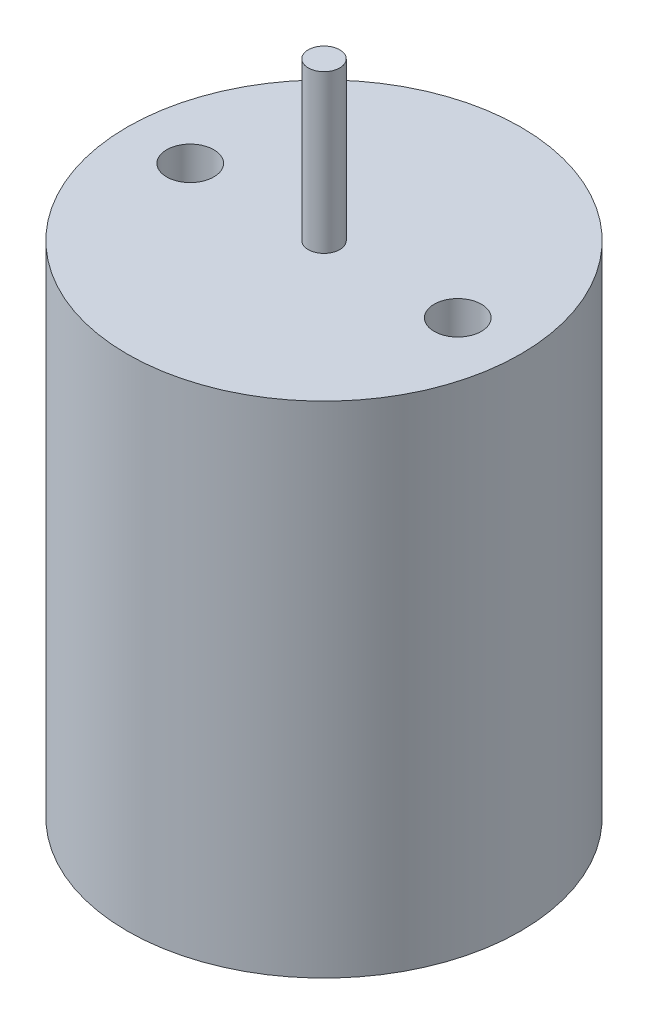
ISO-10303-21;
HEADER;
FILE_DESCRIPTION(('STEP AP214'),'2;1');
FILE_NAME('part.step','',(''),(''),'','','');
FILE_SCHEMA(('AUTOMOTIVE_DESIGN { 1 0 10303 214 1 1 1 1 }'));
ENDSEC;
DATA;
#1=APPLICATION_CONTEXT('core data for automotive mechanical design processes');
#2=APPLICATION_PROTOCOL_DEFINITION('international standard','automotive_design',2000,#1);
#3=PRODUCT_CONTEXT('',#1,'mechanical');
#4=PRODUCT('Part','Part','',(#3));
#5=PRODUCT_RELATED_PRODUCT_CATEGORY('part','',(#4));
#6=PRODUCT_DEFINITION_FORMATION('','',#4);
#7=PRODUCT_DEFINITION_CONTEXT('part definition',#1,'design');
#8=PRODUCT_DEFINITION('design','',#6,#7);
#9=PRODUCT_DEFINITION_SHAPE('','',#8);
#10=(LENGTH_UNIT() NAMED_UNIT(*) SI_UNIT(.MILLI.,.METRE.));
#11=(NAMED_UNIT(*) PLANE_ANGLE_UNIT() SI_UNIT($,.RADIAN.));
#12=(NAMED_UNIT(*) SI_UNIT($,.STERADIAN.) SOLID_ANGLE_UNIT());
#13=UNCERTAINTY_MEASURE_WITH_UNIT(LENGTH_MEASURE(1.E-05),#10,'distance_accuracy_value','');
#14=(GEOMETRIC_REPRESENTATION_CONTEXT(3) GLOBAL_UNCERTAINTY_ASSIGNED_CONTEXT((#13)) GLOBAL_UNIT_ASSIGNED_CONTEXT((#10,
#11,#12)) REPRESENTATION_CONTEXT('',''));
#15=CARTESIAN_POINT('',(0.,0.,0.));
#16=DIRECTION('',(0.,0.,1.));
#17=DIRECTION('',(1.,0.,0.));
#18=AXIS2_PLACEMENT_3D('',#15,#16,#17);
#19=CARTESIAN_POINT('',(0.,31.75,0.));
#20=DIRECTION('',(0.,-1.,0.));
#21=DIRECTION('',(0.,0.,-1.));
#22=AXIS2_PLACEMENT_3D('',#19,#20,#21);
#23=CYLINDRICAL_SURFACE('',#22,12.5);
#24=CARTESIAN_POINT('',(0.,31.75,0.));
#25=DIRECTION('',(0.,1.,0.));
#26=DIRECTION('',(0.,0.,1.));
#27=AXIS2_PLACEMENT_3D('',#24,#25,#26);
#28=CIRCLE('',#27,12.5);
#29=CARTESIAN_POINT('',(0.,31.75,12.5));
#30=VERTEX_POINT('',#29);
#31=EDGE_CURVE('E10',#30,#30,#28,.T.);
#32=ORIENTED_EDGE('',*,*,#31,.F.);
#33=EDGE_LOOP('',(#32));
#34=FACE_BOUND('',#33,.T.);
#35=CARTESIAN_POINT('',(0.,0.,0.));
#36=DIRECTION('',(0.,1.,0.));
#37=DIRECTION('',(0.,0.,1.));
#38=AXIS2_PLACEMENT_3D('',#35,#36,#37);
#39=CIRCLE('',#38,12.5);
#40=CARTESIAN_POINT('',(0.,0.,12.5));
#41=VERTEX_POINT('',#40);
#42=EDGE_CURVE('E42',#41,#41,#39,.T.);
#43=ORIENTED_EDGE('',*,*,#42,.T.);
#44=EDGE_LOOP('',(#43));
#45=FACE_BOUND('',#44,.T.);
#46=ADVANCED_FACE('F39',(#34,#45),#23,.T.);
#47=CARTESIAN_POINT('',(0.,31.75,0.));
#48=DIRECTION('',(0.,1.,0.));
#49=DIRECTION('',(0.,0.,1.));
#50=AXIS2_PLACEMENT_3D('',#47,#48,#49);
#51=PLANE('',#50);
#52=CARTESIAN_POINT('',(-8.5,31.75,0.));
#53=DIRECTION('',(0.,1.,0.));
#54=DIRECTION('',(0.,0.,1.));
#55=AXIS2_PLACEMENT_3D('',#52,#53,#54);
#56=CIRCLE('',#55,1.5);
#57=CARTESIAN_POINT('',(-8.5,31.75,1.5));
#58=VERTEX_POINT('',#57);
#59=EDGE_CURVE('E69',#58,#58,#56,.T.);
#60=ORIENTED_EDGE('',*,*,#59,.F.);
#61=EDGE_LOOP('',(#60));
#62=FACE_BOUND('',#61,.T.);
#63=CARTESIAN_POINT('',(8.5,31.75,0.));
#64=DIRECTION('',(0.,1.,0.));
#65=DIRECTION('',(0.,0.,1.));
#66=AXIS2_PLACEMENT_3D('',#63,#64,#65);
#67=CIRCLE('',#66,1.5);
#68=CARTESIAN_POINT('',(8.5,31.75,1.5));
#69=VERTEX_POINT('',#68);
#70=EDGE_CURVE('E61',#69,#69,#67,.T.);
#71=ORIENTED_EDGE('',*,*,#70,.F.);
#72=EDGE_LOOP('',(#71));
#73=FACE_BOUND('',#72,.T.);
#74=CARTESIAN_POINT('',(0.,31.75,0.));
#75=DIRECTION('',(0.,1.,0.));
#76=DIRECTION('',(0.,0.,1.));
#77=AXIS2_PLACEMENT_3D('',#74,#75,#76);
#78=CIRCLE('',#77,1.);
#79=CARTESIAN_POINT('',(0.,31.75,1.));
#80=VERTEX_POINT('',#79);
#81=EDGE_CURVE('E53',#80,#80,#78,.T.);
#82=ORIENTED_EDGE('',*,*,#81,.F.);
#83=EDGE_LOOP('',(#82));
#84=FACE_BOUND('',#83,.T.);
#85=ORIENTED_EDGE('',*,*,#31,.T.);
#86=EDGE_LOOP('',(#85));
#87=FACE_BOUND('',#86,.T.);
#88=ADVANCED_FACE('F86',(#62,#73,#84,#87),#51,.T.);
#89=CARTESIAN_POINT('',(0.,0.,0.));
#90=DIRECTION('',(0.,1.,0.));
#91=DIRECTION('',(0.,0.,1.));
#92=AXIS2_PLACEMENT_3D('',#89,#90,#91);
#93=PLANE('',#92);
#94=ORIENTED_EDGE('',*,*,#42,.F.);
#95=EDGE_LOOP('',(#94));
#96=FACE_BOUND('',#95,.T.);
#97=ADVANCED_FACE('F89',(#96),#93,.F.);
#98=CARTESIAN_POINT('',(0.,41.75,0.));
#99=DIRECTION('',(0.,-1.,0.));
#100=DIRECTION('',(0.,0.,-1.));
#101=AXIS2_PLACEMENT_3D('',#98,#99,#100);
#102=CYLINDRICAL_SURFACE('',#101,1.);
#103=CARTESIAN_POINT('',(0.,41.75,0.));
#104=DIRECTION('',(0.,1.,0.));
#105=DIRECTION('',(0.,0.,1.));
#106=AXIS2_PLACEMENT_3D('',#103,#104,#105);
#107=CIRCLE('',#106,1.);
#108=CARTESIAN_POINT('',(0.,41.75,1.));
#109=VERTEX_POINT('',#108);
#110=EDGE_CURVE('E51',#109,#109,#107,.T.);
#111=ORIENTED_EDGE('',*,*,#110,.F.);
#112=EDGE_LOOP('',(#111));
#113=FACE_BOUND('',#112,.T.);
#114=ORIENTED_EDGE('',*,*,#81,.T.);
#115=EDGE_LOOP('',(#114));
#116=FACE_BOUND('',#115,.T.);
#117=ADVANCED_FACE('F95',(#113,#116),#102,.T.);
#118=CARTESIAN_POINT('',(0.,41.75,0.));
#119=DIRECTION('',(0.,1.,0.));
#120=DIRECTION('',(0.,0.,1.));
#121=AXIS2_PLACEMENT_3D('',#118,#119,#120);
#122=PLANE('',#121);
#123=ORIENTED_EDGE('',*,*,#110,.T.);
#124=EDGE_LOOP('',(#123));
#125=FACE_BOUND('',#124,.T.);
#126=ADVANCED_FACE('F97',(#125),#122,.T.);
#127=CARTESIAN_POINT('',(8.5,25.4,0.));
#128=DIRECTION('',(0.,1.,0.));
#129=DIRECTION('',(0.,0.,1.));
#130=AXIS2_PLACEMENT_3D('',#127,#128,#129);
#131=CYLINDRICAL_SURFACE('',#130,1.5);
#132=CARTESIAN_POINT('',(8.5,25.4,0.));
#133=DIRECTION('',(0.,1.,0.));
#134=DIRECTION('',(0.,0.,1.));
#135=AXIS2_PLACEMENT_3D('',#132,#133,#134);
#136=CIRCLE('',#135,1.5);
#137=CARTESIAN_POINT('',(8.5,25.4,1.5));
#138=VERTEX_POINT('',#137);
#139=EDGE_CURVE('E65',#138,#138,#136,.T.);
#140=ORIENTED_EDGE('',*,*,#139,.F.);
#141=EDGE_LOOP('',(#140));
#142=FACE_BOUND('',#141,.T.);
#143=ORIENTED_EDGE('',*,*,#70,.T.);
#144=EDGE_LOOP('',(#143));
#145=FACE_BOUND('',#144,.T.);
#146=ADVANCED_FACE('F104',(#142,#145),#131,.F.);
#147=CARTESIAN_POINT('',(8.5,25.4,0.));
#148=DIRECTION('',(0.,1.,0.));
#149=DIRECTION('',(0.,0.,1.));
#150=AXIS2_PLACEMENT_3D('',#147,#148,#149);
#151=PLANE('',#150);
#152=ORIENTED_EDGE('',*,*,#139,.T.);
#153=EDGE_LOOP('',(#152));
#154=FACE_BOUND('',#153,.T.);
#155=ADVANCED_FACE('F82',(#154),#151,.T.);
#156=CARTESIAN_POINT('',(-8.5,25.4,0.));
#157=DIRECTION('',(0.,1.,0.));
#158=DIRECTION('',(0.,0.,1.));
#159=AXIS2_PLACEMENT_3D('',#156,#157,#158);
#160=CYLINDRICAL_SURFACE('',#159,1.5);
#161=CARTESIAN_POINT('',(-8.5,25.4,0.));
#162=DIRECTION('',(0.,1.,0.));
#163=DIRECTION('',(0.,0.,1.));
#164=AXIS2_PLACEMENT_3D('',#161,#162,#163);
#165=CIRCLE('',#164,1.5);
#166=CARTESIAN_POINT('',(-8.5,25.4,1.5));
#167=VERTEX_POINT('',#166);
#168=EDGE_CURVE('E57',#167,#167,#165,.T.);
#169=ORIENTED_EDGE('',*,*,#168,.F.);
#170=EDGE_LOOP('',(#169));
#171=FACE_BOUND('',#170,.T.);
#172=ORIENTED_EDGE('',*,*,#59,.T.);
#173=EDGE_LOOP('',(#172));
#174=FACE_BOUND('',#173,.T.);
#175=ADVANCED_FACE('F79',(#171,#174),#160,.F.);
#176=CARTESIAN_POINT('',(-8.5,25.4,0.));
#177=DIRECTION('',(0.,1.,0.));
#178=DIRECTION('',(0.,0.,1.));
#179=AXIS2_PLACEMENT_3D('',#176,#177,#178);
#180=PLANE('',#179);
#181=ORIENTED_EDGE('',*,*,#168,.T.);
#182=EDGE_LOOP('',(#181));
#183=FACE_BOUND('',#182,.T.);
#184=ADVANCED_FACE('F77',(#183),#180,.T.);
#185=CLOSED_SHELL('',(#46,#88,#97,#117,#126,#146,#155,#175,#184));
#186=MANIFOLD_SOLID_BREP('B2',#185);
#187=ADVANCED_BREP_SHAPE_REPRESENTATION('',(#18,#186),#14);
#188=SHAPE_DEFINITION_REPRESENTATION(#9,#187);
ENDSEC;
END-ISO-10303-21;
